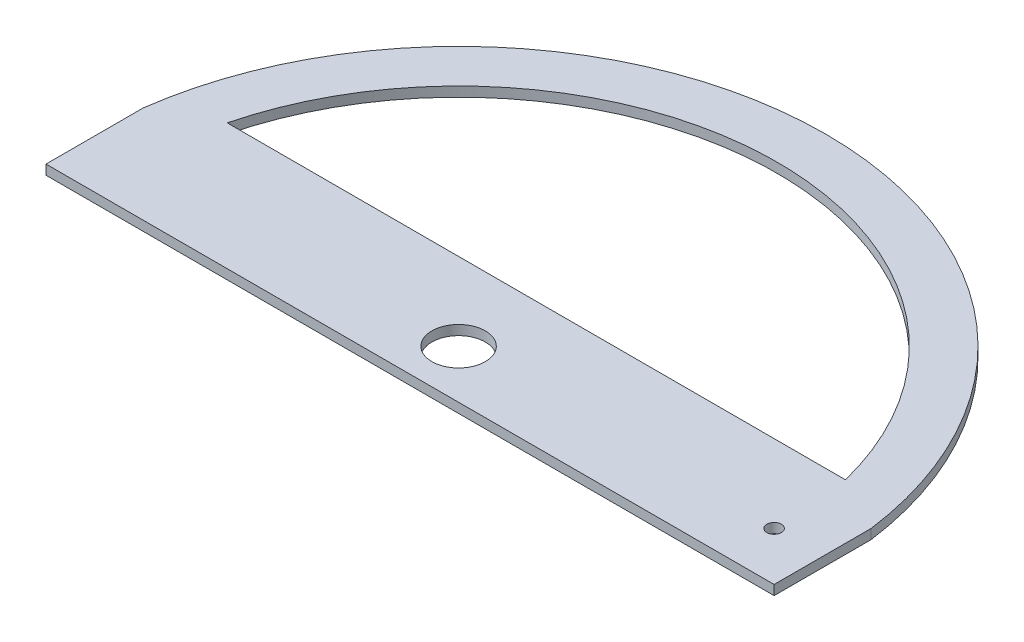
ISO-10303-21;
HEADER;
FILE_DESCRIPTION(('STEP AP214'),'2;1');
FILE_NAME('part.step','',(''),(''),'','','');
FILE_SCHEMA(('AUTOMOTIVE_DESIGN { 1 0 10303 214 1 1 1 1 }'));
ENDSEC;
DATA;
#1=APPLICATION_CONTEXT('core data for automotive mechanical design processes');
#2=APPLICATION_PROTOCOL_DEFINITION('international standard','automotive_design',2000,#1);
#3=PRODUCT_CONTEXT('',#1,'mechanical');
#4=PRODUCT('Part','Part','',(#3));
#5=PRODUCT_RELATED_PRODUCT_CATEGORY('part','',(#4));
#6=PRODUCT_DEFINITION_FORMATION('','',#4);
#7=PRODUCT_DEFINITION_CONTEXT('part definition',#1,'design');
#8=PRODUCT_DEFINITION('design','',#6,#7);
#9=PRODUCT_DEFINITION_SHAPE('','',#8);
#10=(LENGTH_UNIT() NAMED_UNIT(*) SI_UNIT(.MILLI.,.METRE.));
#11=(NAMED_UNIT(*) PLANE_ANGLE_UNIT() SI_UNIT($,.RADIAN.));
#12=(NAMED_UNIT(*) SI_UNIT($,.STERADIAN.) SOLID_ANGLE_UNIT());
#13=UNCERTAINTY_MEASURE_WITH_UNIT(LENGTH_MEASURE(1.E-05),#10,'distance_accuracy_value','');
#14=(GEOMETRIC_REPRESENTATION_CONTEXT(3) GLOBAL_UNCERTAINTY_ASSIGNED_CONTEXT((#13)) GLOBAL_UNIT_ASSIGNED_CONTEXT((#10,
#11,#12)) REPRESENTATION_CONTEXT('',''));
#15=CARTESIAN_POINT('',(0.,0.,0.));
#16=DIRECTION('',(0.,0.,1.));
#17=DIRECTION('',(1.,0.,0.));
#18=AXIS2_PLACEMENT_3D('',#15,#16,#17);
#19=CARTESIAN_POINT('',(-5.68989300120393E-13,2.,0.));
#20=DIRECTION('',(0.,1.,0.));
#21=DIRECTION('',(0.,0.,1.));
#22=AXIS2_PLACEMENT_3D('',#19,#20,#21);
#23=PLANE('',#22);
#24=CARTESIAN_POINT('',(-5.68989300120393E-13,2.,0.));
#25=DIRECTION('',(0.,1.,0.));
#26=DIRECTION('',(0.,0.,1.));
#27=AXIS2_PLACEMENT_3D('',#24,#25,#26);
#28=CIRCLE('',#27,5.50000000000056);
#29=CARTESIAN_POINT('',(-5.68989300120393E-13,2.,5.50000000000061));
#30=VERTEX_POINT('',#29);
#31=EDGE_CURVE('E192',#30,#30,#28,.T.);
#32=ORIENTED_EDGE('',*,*,#31,.F.);
#33=EDGE_LOOP('',(#32));
#34=FACE_BOUND('',#33,.T.);
#35=CARTESIAN_POINT('',(64.9999999999994,2.,0.));
#36=DIRECTION('',(0.,1.,0.));
#37=DIRECTION('',(0.,0.,1.));
#38=AXIS2_PLACEMENT_3D('',#35,#36,#37);
#39=CIRCLE('',#38,1.5);
#40=CARTESIAN_POINT('',(64.9999999999994,2.,1.5));
#41=VERTEX_POINT('',#40);
#42=EDGE_CURVE('E99',#41,#41,#39,.T.);
#43=ORIENTED_EDGE('',*,*,#42,.F.);
#44=EDGE_LOOP('',(#43));
#45=FACE_BOUND('',#44,.T.);
#46=CARTESIAN_POINT('',(-5.68989300120393E-13,2.,0.));
#47=DIRECTION('',(0.,1.,0.));
#48=DIRECTION('',(0.,0.,1.));
#49=AXIS2_PLACEMENT_3D('',#46,#47,#48);
#50=CIRCLE('',#49,75.6637297521078);
#51=CARTESIAN_POINT('',(74.9999999999994,2.,-9.99999999999983));
#52=VERTEX_POINT('',#51);
#53=CARTESIAN_POINT('',(-75.0000000000006,2.,-9.99999999999994));
#54=VERTEX_POINT('',#53);
#55=EDGE_CURVE('E106',#52,#54,#50,.T.);
#56=ORIENTED_EDGE('',*,*,#55,.T.);
#57=DIRECTION('',(0.,0.,1.));
#58=VECTOR('',#57,1.);
#59=CARTESIAN_POINT('',(-75.0000000000006,2.,10.0000000000001));
#60=LINE('',#59,#58);
#61=CARTESIAN_POINT('',(-75.0000000000006,2.,10.0000000000001));
#62=VERTEX_POINT('',#61);
#63=EDGE_CURVE('E109',#54,#62,#60,.T.);
#64=ORIENTED_EDGE('',*,*,#63,.T.);
#65=DIRECTION('',(1.,0.,0.));
#66=VECTOR('',#65,1.);
#67=CARTESIAN_POINT('',(74.9999999999994,2.,10.));
#68=LINE('',#67,#66);
#69=CARTESIAN_POINT('',(74.9999999999994,2.,10.));
#70=VERTEX_POINT('',#69);
#71=EDGE_CURVE('E112',#62,#70,#68,.T.);
#72=ORIENTED_EDGE('',*,*,#71,.T.);
#73=DIRECTION('',(0.,0.,-1.));
#74=VECTOR('',#73,1.);
#75=CARTESIAN_POINT('',(74.9999999999994,2.,10.));
#76=LINE('',#75,#74);
#77=EDGE_CURVE('E114',#70,#52,#76,.T.);
#78=ORIENTED_EDGE('',*,*,#77,.T.);
#79=EDGE_LOOP('',(#56,#64,#72,#78));
#80=FACE_BOUND('',#79,.T.);
#81=DIRECTION('',(1.,0.,0.));
#82=VECTOR('',#81,1.);
#83=CARTESIAN_POINT('',(-63.6797066351354,2.,-16.0193747637355));
#84=LINE('',#83,#82);
#85=CARTESIAN_POINT('',(-63.6797066351354,2.,-16.0193747637355));
#86=VERTEX_POINT('',#85);
#87=CARTESIAN_POINT('',(63.6797066351343,2.,-16.0193747637355));
#88=VERTEX_POINT('',#87);
#89=EDGE_CURVE('E85',#86,#88,#84,.T.);
#90=ORIENTED_EDGE('',*,*,#89,.F.);
#91=CARTESIAN_POINT('',(-5.68989300120393E-13,2.,0.));
#92=DIRECTION('',(0.,1.,0.));
#93=DIRECTION('',(0.,0.,1.));
#94=AXIS2_PLACEMENT_3D('',#91,#92,#93);
#95=CIRCLE('',#94,65.6637297521078);
#96=EDGE_CURVE('E91',#88,#86,#95,.T.);
#97=ORIENTED_EDGE('',*,*,#96,.F.);
#98=EDGE_LOOP('',(#90,#97));
#99=FACE_BOUND('',#98,.T.);
#100=ADVANCED_FACE('F33',(#34,#45,#80,#99),#23,.T.);
#101=CARTESIAN_POINT('',(-5.68989300120393E-13,0.,0.));
#102=DIRECTION('',(0.,1.,0.));
#103=DIRECTION('',(0.,0.,1.));
#104=AXIS2_PLACEMENT_3D('',#101,#102,#103);
#105=PLANE('',#104);
#106=CARTESIAN_POINT('',(-5.68989300120393E-13,0.,0.));
#107=DIRECTION('',(0.,1.,0.));
#108=DIRECTION('',(0.,0.,1.));
#109=AXIS2_PLACEMENT_3D('',#106,#107,#108);
#110=CIRCLE('',#109,5.50000000000056);
#111=CARTESIAN_POINT('',(-5.68989300120393E-13,0.,5.50000000000061));
#112=VERTEX_POINT('',#111);
#113=EDGE_CURVE('E102',#112,#112,#110,.T.);
#114=ORIENTED_EDGE('',*,*,#113,.T.);
#115=EDGE_LOOP('',(#114));
#116=FACE_BOUND('',#115,.T.);
#117=CARTESIAN_POINT('',(64.9999999999994,0.,0.));
#118=DIRECTION('',(0.,1.,0.));
#119=DIRECTION('',(0.,0.,1.));
#120=AXIS2_PLACEMENT_3D('',#117,#118,#119);
#121=CIRCLE('',#120,1.5);
#122=CARTESIAN_POINT('',(64.9999999999994,0.,1.5));
#123=VERTEX_POINT('',#122);
#124=EDGE_CURVE('E193',#123,#123,#121,.T.);
#125=ORIENTED_EDGE('',*,*,#124,.T.);
#126=EDGE_LOOP('',(#125));
#127=FACE_BOUND('',#126,.T.);
#128=CARTESIAN_POINT('',(-5.68989300120393E-13,0.,0.));
#129=DIRECTION('',(0.,1.,0.));
#130=DIRECTION('',(0.,0.,1.));
#131=AXIS2_PLACEMENT_3D('',#128,#129,#130);
#132=CIRCLE('',#131,75.6637297521078);
#133=CARTESIAN_POINT('',(74.9999999999994,0.,-9.99999999999983));
#134=VERTEX_POINT('',#133);
#135=CARTESIAN_POINT('',(-75.0000000000006,0.,-9.99999999999994));
#136=VERTEX_POINT('',#135);
#137=EDGE_CURVE('E105',#134,#136,#132,.T.);
#138=ORIENTED_EDGE('',*,*,#137,.F.);
#139=DIRECTION('',(0.,0.,-1.));
#140=VECTOR('',#139,1.);
#141=CARTESIAN_POINT('',(74.9999999999994,0.,10.));
#142=LINE('',#141,#140);
#143=CARTESIAN_POINT('',(74.9999999999994,0.,10.));
#144=VERTEX_POINT('',#143);
#145=EDGE_CURVE('E110',#144,#134,#142,.T.);
#146=ORIENTED_EDGE('',*,*,#145,.F.);
#147=DIRECTION('',(1.,0.,0.));
#148=VECTOR('',#147,1.);
#149=CARTESIAN_POINT('',(74.9999999999994,0.,10.));
#150=LINE('',#149,#148);
#151=CARTESIAN_POINT('',(-75.0000000000006,0.,10.0000000000001));
#152=VERTEX_POINT('',#151);
#153=EDGE_CURVE('E121',#152,#144,#150,.T.);
#154=ORIENTED_EDGE('',*,*,#153,.F.);
#155=DIRECTION('',(0.,0.,1.));
#156=VECTOR('',#155,1.);
#157=CARTESIAN_POINT('',(-75.0000000000006,0.,10.0000000000001));
#158=LINE('',#157,#156);
#159=EDGE_CURVE('E119',#136,#152,#158,.T.);
#160=ORIENTED_EDGE('',*,*,#159,.F.);
#161=EDGE_LOOP('',(#138,#146,#154,#160));
#162=FACE_BOUND('',#161,.T.);
#163=CARTESIAN_POINT('',(-5.68989300120393E-13,0.,0.));
#164=DIRECTION('',(0.,1.,0.));
#165=DIRECTION('',(0.,0.,1.));
#166=AXIS2_PLACEMENT_3D('',#163,#164,#165);
#167=CIRCLE('',#166,65.6637297521078);
#168=CARTESIAN_POINT('',(63.6797066351343,0.,-16.0193747637355));
#169=VERTEX_POINT('',#168);
#170=CARTESIAN_POINT('',(-63.6797066351354,0.,-16.0193747637355));
#171=VERTEX_POINT('',#170);
#172=EDGE_CURVE('E55',#169,#171,#167,.T.);
#173=ORIENTED_EDGE('',*,*,#172,.T.);
#174=DIRECTION('',(1.,0.,0.));
#175=VECTOR('',#174,1.);
#176=CARTESIAN_POINT('',(-63.6797066351354,0.,-16.0193747637355));
#177=LINE('',#176,#175);
#178=EDGE_CURVE('E95',#171,#169,#177,.T.);
#179=ORIENTED_EDGE('',*,*,#178,.T.);
#180=EDGE_LOOP('',(#173,#179));
#181=FACE_BOUND('',#180,.T.);
#182=ADVANCED_FACE('F139',(#116,#127,#162,#181),#105,.F.);
#183=CARTESIAN_POINT('',(-5.68989300120393E-13,2.,0.));
#184=DIRECTION('',(0.,-1.,0.));
#185=DIRECTION('',(0.,0.,-1.));
#186=AXIS2_PLACEMENT_3D('',#183,#184,#185);
#187=CYLINDRICAL_SURFACE('',#186,75.6637297521078);
#188=ORIENTED_EDGE('',*,*,#137,.T.);
#189=DIRECTION('',(0.,-1.,0.));
#190=VECTOR('',#189,1.);
#191=CARTESIAN_POINT('',(-75.0000000000006,2.,-9.99999999999994));
#192=LINE('',#191,#190);
#193=EDGE_CURVE('E11',#54,#136,#192,.T.);
#194=ORIENTED_EDGE('',*,*,#193,.F.);
#195=ORIENTED_EDGE('',*,*,#55,.F.);
#196=DIRECTION('',(0.,-1.,0.));
#197=VECTOR('',#196,1.);
#198=CARTESIAN_POINT('',(74.9999999999994,2.,-9.99999999999983));
#199=LINE('',#198,#197);
#200=EDGE_CURVE('E116',#52,#134,#199,.T.);
#201=ORIENTED_EDGE('',*,*,#200,.T.);
#202=EDGE_LOOP('',(#188,#194,#195,#201));
#203=FACE_BOUND('',#202,.T.);
#204=ADVANCED_FACE('F35',(#203),#187,.T.);
#205=CARTESIAN_POINT('',(-75.0000000000006,2.,10.0000000000001));
#206=DIRECTION('',(1.,0.,0.));
#207=DIRECTION('',(0.,0.,-1.));
#208=AXIS2_PLACEMENT_3D('',#205,#206,#207);
#209=PLANE('',#208);
#210=ORIENTED_EDGE('',*,*,#159,.T.);
#211=DIRECTION('',(0.,-1.,0.));
#212=VECTOR('',#211,1.);
#213=CARTESIAN_POINT('',(-75.0000000000006,2.,10.0000000000001));
#214=LINE('',#213,#212);
#215=EDGE_CURVE('E41',#62,#152,#214,.T.);
#216=ORIENTED_EDGE('',*,*,#215,.F.);
#217=ORIENTED_EDGE('',*,*,#63,.F.);
#218=ORIENTED_EDGE('',*,*,#193,.T.);
#219=EDGE_LOOP('',(#210,#216,#217,#218));
#220=FACE_BOUND('',#219,.T.);
#221=ADVANCED_FACE('F149',(#220),#209,.F.);
#222=CARTESIAN_POINT('',(74.9999999999994,2.,10.));
#223=DIRECTION('',(0.,0.,-1.));
#224=DIRECTION('',(-1.,0.,0.));
#225=AXIS2_PLACEMENT_3D('',#222,#223,#224);
#226=PLANE('',#225);
#227=ORIENTED_EDGE('',*,*,#153,.T.);
#228=DIRECTION('',(0.,-1.,0.));
#229=VECTOR('',#228,1.);
#230=CARTESIAN_POINT('',(74.9999999999994,2.,10.));
#231=LINE('',#230,#229);
#232=EDGE_CURVE('E126',#70,#144,#231,.T.);
#233=ORIENTED_EDGE('',*,*,#232,.F.);
#234=ORIENTED_EDGE('',*,*,#71,.F.);
#235=ORIENTED_EDGE('',*,*,#215,.T.);
#236=EDGE_LOOP('',(#227,#233,#234,#235));
#237=FACE_BOUND('',#236,.T.);
#238=ADVANCED_FACE('F133',(#237),#226,.F.);
#239=CARTESIAN_POINT('',(74.9999999999994,2.,10.));
#240=DIRECTION('',(-1.,0.,0.));
#241=DIRECTION('',(0.,0.,1.));
#242=AXIS2_PLACEMENT_3D('',#239,#240,#241);
#243=PLANE('',#242);
#244=ORIENTED_EDGE('',*,*,#145,.T.);
#245=ORIENTED_EDGE('',*,*,#200,.F.);
#246=ORIENTED_EDGE('',*,*,#77,.F.);
#247=ORIENTED_EDGE('',*,*,#232,.T.);
#248=EDGE_LOOP('',(#244,#245,#246,#247));
#249=FACE_BOUND('',#248,.T.);
#250=ADVANCED_FACE('F143',(#249),#243,.F.);
#251=CARTESIAN_POINT('',(-5.68989300120393E-13,2.,0.));
#252=DIRECTION('',(0.,-1.,0.));
#253=DIRECTION('',(0.,0.,-1.));
#254=AXIS2_PLACEMENT_3D('',#251,#252,#253);
#255=CYLINDRICAL_SURFACE('',#254,65.6637297521078);
#256=ORIENTED_EDGE('',*,*,#172,.F.);
#257=DIRECTION('',(0.,-1.,0.));
#258=VECTOR('',#257,1.);
#259=CARTESIAN_POINT('',(63.6797066351343,2.,-16.0193747637355));
#260=LINE('',#259,#258);
#261=EDGE_CURVE('E87',#88,#169,#260,.T.);
#262=ORIENTED_EDGE('',*,*,#261,.F.);
#263=ORIENTED_EDGE('',*,*,#96,.T.);
#264=DIRECTION('',(0.,-1.,0.));
#265=VECTOR('',#264,1.);
#266=CARTESIAN_POINT('',(-63.6797066351354,2.,-16.0193747637355));
#267=LINE('',#266,#265);
#268=EDGE_CURVE('E48',#86,#171,#267,.T.);
#269=ORIENTED_EDGE('',*,*,#268,.T.);
#270=EDGE_LOOP('',(#256,#262,#263,#269));
#271=FACE_BOUND('',#270,.T.);
#272=ADVANCED_FACE('F93',(#271),#255,.F.);
#273=CARTESIAN_POINT('',(-63.6797066351354,2.,-16.0193747637355));
#274=DIRECTION('',(0.,0.,-1.));
#275=DIRECTION('',(-1.,0.,0.));
#276=AXIS2_PLACEMENT_3D('',#273,#274,#275);
#277=PLANE('',#276);
#278=ORIENTED_EDGE('',*,*,#178,.F.);
#279=ORIENTED_EDGE('',*,*,#268,.F.);
#280=ORIENTED_EDGE('',*,*,#89,.T.);
#281=ORIENTED_EDGE('',*,*,#261,.T.);
#282=EDGE_LOOP('',(#278,#279,#280,#281));
#283=FACE_BOUND('',#282,.T.);
#284=ADVANCED_FACE('F86',(#283),#277,.T.);
#285=CARTESIAN_POINT('',(64.9999999999994,0.,0.));
#286=DIRECTION('',(0.,1.,0.));
#287=DIRECTION('',(0.,0.,1.));
#288=AXIS2_PLACEMENT_3D('',#285,#286,#287);
#289=CYLINDRICAL_SURFACE('',#288,1.5);
#290=ORIENTED_EDGE('',*,*,#124,.F.);
#291=EDGE_LOOP('',(#290));
#292=FACE_BOUND('',#291,.T.);
#293=ORIENTED_EDGE('',*,*,#42,.T.);
#294=EDGE_LOOP('',(#293));
#295=FACE_BOUND('',#294,.T.);
#296=ADVANCED_FACE('F176',(#292,#295),#289,.F.);
#297=CARTESIAN_POINT('',(-5.68989300120393E-13,0.,0.));
#298=DIRECTION('',(0.,1.,0.));
#299=DIRECTION('',(0.,0.,1.));
#300=AXIS2_PLACEMENT_3D('',#297,#298,#299);
#301=CYLINDRICAL_SURFACE('',#300,5.50000000000056);
#302=ORIENTED_EDGE('',*,*,#113,.F.);
#303=EDGE_LOOP('',(#302));
#304=FACE_BOUND('',#303,.T.);
#305=ORIENTED_EDGE('',*,*,#31,.T.);
#306=EDGE_LOOP('',(#305));
#307=FACE_BOUND('',#306,.T.);
#308=ADVANCED_FACE('F180',(#304,#307),#301,.F.);
#309=CLOSED_SHELL('',(#100,#182,#204,#221,#238,#250,#272,#284,#296,#308));
#310=MANIFOLD_SOLID_BREP('B2',#309);
#311=ADVANCED_BREP_SHAPE_REPRESENTATION('',(#18,#310),#14);
#312=SHAPE_DEFINITION_REPRESENTATION(#9,#311);
ENDSEC;
END-ISO-10303-21;
